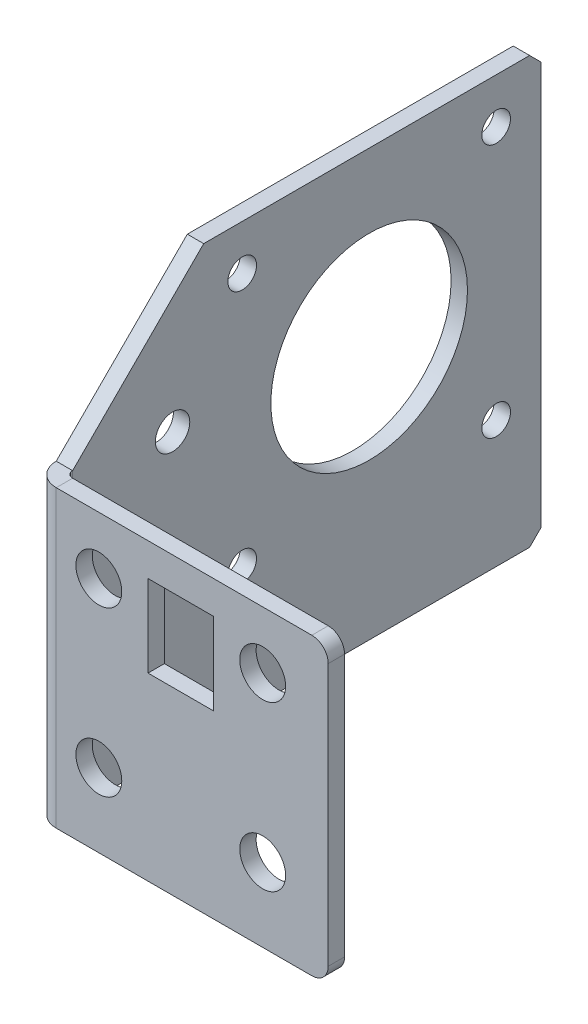
ISO-10303-21;
HEADER;
FILE_DESCRIPTION(('STEP AP214'),'2;1');
FILE_NAME('part.step','',(''),(''),'','','');
FILE_SCHEMA(('AUTOMOTIVE_DESIGN { 1 0 10303 214 1 1 1 1 }'));
ENDSEC;
DATA;
#1=APPLICATION_CONTEXT('core data for automotive mechanical design processes');
#2=APPLICATION_PROTOCOL_DEFINITION('international standard','automotive_design',2000,#1);
#3=PRODUCT_CONTEXT('',#1,'mechanical');
#4=PRODUCT('Part','Part','',(#3));
#5=PRODUCT_RELATED_PRODUCT_CATEGORY('part','',(#4));
#6=PRODUCT_DEFINITION_FORMATION('','',#4);
#7=PRODUCT_DEFINITION_CONTEXT('part definition',#1,'design');
#8=PRODUCT_DEFINITION('design','',#6,#7);
#9=PRODUCT_DEFINITION_SHAPE('','',#8);
#10=(LENGTH_UNIT() NAMED_UNIT(*) SI_UNIT(.MILLI.,.METRE.));
#11=(NAMED_UNIT(*) PLANE_ANGLE_UNIT() SI_UNIT($,.RADIAN.));
#12=(NAMED_UNIT(*) SI_UNIT($,.STERADIAN.) SOLID_ANGLE_UNIT());
#13=UNCERTAINTY_MEASURE_WITH_UNIT(LENGTH_MEASURE(1.E-05),#10,'distance_accuracy_value','');
#14=(GEOMETRIC_REPRESENTATION_CONTEXT(3) GLOBAL_UNCERTAINTY_ASSIGNED_CONTEXT((#13)) GLOBAL_UNIT_ASSIGNED_CONTEXT((#10,
#11,#12)) REPRESENTATION_CONTEXT('',''));
#15=CARTESIAN_POINT('',(0.,0.,0.));
#16=DIRECTION('',(0.,0.,1.));
#17=DIRECTION('',(1.,0.,0.));
#18=AXIS2_PLACEMENT_3D('',#15,#16,#17);
#19=CARTESIAN_POINT('',(0.,52.,0.));
#20=DIRECTION('',(0.,0.,-1.));
#21=DIRECTION('',(-1.,0.,0.));
#22=AXIS2_PLACEMENT_3D('',#19,#20,#21);
#23=PLANE('',#22);
#24=DIRECTION('',(-1.,0.,0.));
#25=VECTOR('',#24,1.);
#26=CARTESIAN_POINT('',(22.,22.,0.));
#27=LINE('',#26,#25);
#28=CARTESIAN_POINT('',(22.,22.,0.));
#29=VERTEX_POINT('',#28);
#30=CARTESIAN_POINT('',(14.,22.,0.));
#31=VERTEX_POINT('',#30);
#32=EDGE_CURVE('E163',#29,#31,#27,.T.);
#33=ORIENTED_EDGE('',*,*,#32,.T.);
#34=DIRECTION('',(0.,1.,0.));
#35=VECTOR('',#34,1.);
#36=CARTESIAN_POINT('',(14.,32.,0.));
#37=LINE('',#36,#35);
#38=CARTESIAN_POINT('',(14.,32.,0.));
#39=VERTEX_POINT('',#38);
#40=EDGE_CURVE('E157',#31,#39,#37,.T.);
#41=ORIENTED_EDGE('',*,*,#40,.T.);
#42=DIRECTION('',(1.,0.,0.));
#43=VECTOR('',#42,1.);
#44=CARTESIAN_POINT('',(22.,32.,0.));
#45=LINE('',#44,#43);
#46=CARTESIAN_POINT('',(22.,32.,0.));
#47=VERTEX_POINT('',#46);
#48=EDGE_CURVE('E166',#39,#47,#45,.T.);
#49=ORIENTED_EDGE('',*,*,#48,.T.);
#50=DIRECTION('',(0.,-1.,0.));
#51=VECTOR('',#50,1.);
#52=CARTESIAN_POINT('',(22.,32.,0.));
#53=LINE('',#52,#51);
#54=EDGE_CURVE('E52',#47,#29,#53,.T.);
#55=ORIENTED_EDGE('',*,*,#54,.T.);
#56=EDGE_LOOP('',(#33,#41,#49,#55));
#57=FACE_BOUND('',#56,.T.);
#58=CARTESIAN_POINT('',(8.,29.,0.));
#59=DIRECTION('',(0.,0.,1.));
#60=DIRECTION('',(-1.,0.,0.));
#61=AXIS2_PLACEMENT_3D('',#58,#59,#60);
#62=CIRCLE('',#61,2.8);
#63=CARTESIAN_POINT('',(5.2,29.,0.));
#64=VERTEX_POINT('',#63);
#65=EDGE_CURVE('E191',#64,#64,#62,.T.);
#66=ORIENTED_EDGE('',*,*,#65,.F.);
#67=EDGE_LOOP('',(#66));
#68=FACE_BOUND('',#67,.T.);
#69=CARTESIAN_POINT('',(8.,9.,0.));
#70=DIRECTION('',(0.,0.,1.));
#71=DIRECTION('',(1.,0.,0.));
#72=AXIS2_PLACEMENT_3D('',#69,#70,#71);
#73=CIRCLE('',#72,2.8);
#74=CARTESIAN_POINT('',(10.8,9.,0.));
#75=VERTEX_POINT('',#74);
#76=EDGE_CURVE('E205',#75,#75,#73,.T.);
#77=ORIENTED_EDGE('',*,*,#76,.F.);
#78=EDGE_LOOP('',(#77));
#79=FACE_BOUND('',#78,.T.);
#80=CARTESIAN_POINT('',(28.,9.,0.));
#81=DIRECTION('',(0.,0.,1.));
#82=DIRECTION('',(-1.,0.,0.));
#83=AXIS2_PLACEMENT_3D('',#80,#81,#82);
#84=CIRCLE('',#83,2.8);
#85=CARTESIAN_POINT('',(25.2,9.,0.));
#86=VERTEX_POINT('',#85);
#87=EDGE_CURVE('E199',#86,#86,#84,.T.);
#88=ORIENTED_EDGE('',*,*,#87,.F.);
#89=EDGE_LOOP('',(#88));
#90=FACE_BOUND('',#89,.T.);
#91=CARTESIAN_POINT('',(28.,29.,0.));
#92=DIRECTION('',(0.,0.,1.));
#93=DIRECTION('',(1.,0.,0.));
#94=AXIS2_PLACEMENT_3D('',#91,#92,#93);
#95=CIRCLE('',#94,2.8);
#96=CARTESIAN_POINT('',(30.8,29.,0.));
#97=VERTEX_POINT('',#96);
#98=EDGE_CURVE('E198',#97,#97,#95,.T.);
#99=ORIENTED_EDGE('',*,*,#98,.F.);
#100=EDGE_LOOP('',(#99));
#101=FACE_BOUND('',#100,.T.);
#102=DIRECTION('',(1.,0.,0.));
#103=VECTOR('',#102,1.);
#104=CARTESIAN_POINT('',(0.,0.,0.));
#105=LINE('',#104,#103);
#106=CARTESIAN_POINT('',(2.8,0.,0.));
#107=VERTEX_POINT('',#106);
#108=CARTESIAN_POINT('',(34.,0.,0.));
#109=VERTEX_POINT('',#108);
#110=EDGE_CURVE('E290',#107,#109,#105,.T.);
#111=ORIENTED_EDGE('',*,*,#110,.T.);
#112=CARTESIAN_POINT('',(34.,2.,0.));
#113=DIRECTION('',(0.,0.,-1.));
#114=DIRECTION('',(-1.,0.,0.));
#115=AXIS2_PLACEMENT_3D('',#112,#113,#114);
#116=CIRCLE('',#115,2.);
#117=CARTESIAN_POINT('',(36.,2.00000000000002,0.));
#118=VERTEX_POINT('',#117);
#119=EDGE_CURVE('E345',#109,#118,#116,.F.);
#120=ORIENTED_EDGE('',*,*,#119,.T.);
#121=DIRECTION('',(0.,-1.,0.));
#122=VECTOR('',#121,1.);
#123=CARTESIAN_POINT('',(36.,52.,0.));
#124=LINE('',#123,#122);
#125=CARTESIAN_POINT('',(36.,34.,0.));
#126=VERTEX_POINT('',#125);
#127=EDGE_CURVE('E331',#126,#118,#124,.T.);
#128=ORIENTED_EDGE('',*,*,#127,.F.);
#129=CARTESIAN_POINT('',(34.,34.,0.));
#130=DIRECTION('',(0.,0.,-1.));
#131=DIRECTION('',(-1.,0.,0.));
#132=AXIS2_PLACEMENT_3D('',#129,#130,#131);
#133=CIRCLE('',#132,2.);
#134=CARTESIAN_POINT('',(34.,36.,0.));
#135=VERTEX_POINT('',#134);
#136=EDGE_CURVE('E343',#126,#135,#133,.F.);
#137=ORIENTED_EDGE('',*,*,#136,.T.);
#138=DIRECTION('',(-1.,0.,0.));
#139=VECTOR('',#138,1.);
#140=CARTESIAN_POINT('',(0.,36.,0.));
#141=LINE('',#140,#139);
#142=CARTESIAN_POINT('',(2.8,36.,0.));
#143=VERTEX_POINT('',#142);
#144=EDGE_CURVE('E284',#135,#143,#141,.T.);
#145=ORIENTED_EDGE('',*,*,#144,.T.);
#146=DIRECTION('',(0.,-1.,0.));
#147=VECTOR('',#146,1.);
#148=CARTESIAN_POINT('',(2.8,52.,0.));
#149=LINE('',#148,#147);
#150=EDGE_CURVE('E298',#143,#107,#149,.T.);
#151=ORIENTED_EDGE('',*,*,#150,.T.);
#152=EDGE_LOOP('',(#111,#120,#128,#137,#145,#151));
#153=FACE_BOUND('',#152,.T.);
#154=ADVANCED_FACE('F37',(#57,#68,#79,#90,#101,#153),#23,.F.);
#155=CARTESIAN_POINT('',(36.,52.,-2.));
#156=DIRECTION('',(1.,0.,0.));
#157=DIRECTION('',(0.,0.,-1.));
#158=AXIS2_PLACEMENT_3D('',#155,#156,#157);
#159=PLANE('',#158);
#160=ORIENTED_EDGE('',*,*,#127,.T.);
#161=DIRECTION('',(0.,0.,1.));
#162=VECTOR('',#161,1.);
#163=CARTESIAN_POINT('',(36.,2.,-2.));
#164=LINE('',#163,#162);
#165=CARTESIAN_POINT('',(36.,2.00000000000002,-2.));
#166=VERTEX_POINT('',#165);
#167=EDGE_CURVE('E350',#118,#166,#164,.F.);
#168=ORIENTED_EDGE('',*,*,#167,.T.);
#169=DIRECTION('',(0.,-1.,0.));
#170=VECTOR('',#169,1.);
#171=CARTESIAN_POINT('',(36.,52.,-2.));
#172=LINE('',#171,#170);
#173=CARTESIAN_POINT('',(36.,34.,-2.));
#174=VERTEX_POINT('',#173);
#175=EDGE_CURVE('E328',#174,#166,#172,.T.);
#176=ORIENTED_EDGE('',*,*,#175,.F.);
#177=DIRECTION('',(0.,0.,-1.));
#178=VECTOR('',#177,1.);
#179=CARTESIAN_POINT('',(36.,34.,-2.));
#180=LINE('',#179,#178);
#181=EDGE_CURVE('E347',#174,#126,#180,.F.);
#182=ORIENTED_EDGE('',*,*,#181,.T.);
#183=EDGE_LOOP('',(#160,#168,#176,#182));
#184=FACE_BOUND('',#183,.T.);
#185=ADVANCED_FACE('F370',(#184),#159,.T.);
#186=CARTESIAN_POINT('',(0.,52.,-2.));
#187=DIRECTION('',(0.,0.,-1.));
#188=DIRECTION('',(-1.,0.,0.));
#189=AXIS2_PLACEMENT_3D('',#186,#187,#188);
#190=PLANE('',#189);
#191=DIRECTION('',(0.,1.,0.));
#192=VECTOR('',#191,1.);
#193=CARTESIAN_POINT('',(14.,32.,-2.));
#194=LINE('',#193,#192);
#195=CARTESIAN_POINT('',(14.,22.,-2.));
#196=VERTEX_POINT('',#195);
#197=CARTESIAN_POINT('',(14.,32.,-2.));
#198=VERTEX_POINT('',#197);
#199=EDGE_CURVE('E60',#196,#198,#194,.T.);
#200=ORIENTED_EDGE('',*,*,#199,.F.);
#201=DIRECTION('',(-1.,0.,0.));
#202=VECTOR('',#201,1.);
#203=CARTESIAN_POINT('',(22.,22.,-2.));
#204=LINE('',#203,#202);
#205=CARTESIAN_POINT('',(22.,22.,-2.));
#206=VERTEX_POINT('',#205);
#207=EDGE_CURVE('E172',#206,#196,#204,.T.);
#208=ORIENTED_EDGE('',*,*,#207,.F.);
#209=DIRECTION('',(0.,-1.,0.));
#210=VECTOR('',#209,1.);
#211=CARTESIAN_POINT('',(22.,32.,-2.));
#212=LINE('',#211,#210);
#213=CARTESIAN_POINT('',(22.,32.,-2.));
#214=VERTEX_POINT('',#213);
#215=EDGE_CURVE('E175',#214,#206,#212,.T.);
#216=ORIENTED_EDGE('',*,*,#215,.F.);
#217=DIRECTION('',(1.,0.,0.));
#218=VECTOR('',#217,1.);
#219=CARTESIAN_POINT('',(22.,32.,-2.));
#220=LINE('',#219,#218);
#221=EDGE_CURVE('E184',#198,#214,#220,.T.);
#222=ORIENTED_EDGE('',*,*,#221,.F.);
#223=EDGE_LOOP('',(#200,#208,#216,#222));
#224=FACE_BOUND('',#223,.T.);
#225=CARTESIAN_POINT('',(8.,29.,-2.));
#226=DIRECTION('',(0.,0.,1.));
#227=DIRECTION('',(-1.,0.,0.));
#228=AXIS2_PLACEMENT_3D('',#225,#226,#227);
#229=CIRCLE('',#228,2.8);
#230=CARTESIAN_POINT('',(5.2,29.,-2.));
#231=VERTEX_POINT('',#230);
#232=EDGE_CURVE('E208',#231,#231,#229,.T.);
#233=ORIENTED_EDGE('',*,*,#232,.T.);
#234=EDGE_LOOP('',(#233));
#235=FACE_BOUND('',#234,.T.);
#236=CARTESIAN_POINT('',(8.,9.,-2.));
#237=DIRECTION('',(0.,0.,1.));
#238=DIRECTION('',(1.,0.,0.));
#239=AXIS2_PLACEMENT_3D('',#236,#237,#238);
#240=CIRCLE('',#239,2.8);
#241=CARTESIAN_POINT('',(10.8,9.,-2.));
#242=VERTEX_POINT('',#241);
#243=EDGE_CURVE('E202',#242,#242,#240,.T.);
#244=ORIENTED_EDGE('',*,*,#243,.T.);
#245=EDGE_LOOP('',(#244));
#246=FACE_BOUND('',#245,.T.);
#247=CARTESIAN_POINT('',(28.,9.,-2.));
#248=DIRECTION('',(0.,0.,1.));
#249=DIRECTION('',(-1.,0.,0.));
#250=AXIS2_PLACEMENT_3D('',#247,#248,#249);
#251=CIRCLE('',#250,2.8);
#252=CARTESIAN_POINT('',(25.2,9.,-2.));
#253=VERTEX_POINT('',#252);
#254=EDGE_CURVE('E195',#253,#253,#251,.T.);
#255=ORIENTED_EDGE('',*,*,#254,.T.);
#256=EDGE_LOOP('',(#255));
#257=FACE_BOUND('',#256,.T.);
#258=CARTESIAN_POINT('',(28.,29.,-2.));
#259=DIRECTION('',(0.,0.,1.));
#260=DIRECTION('',(1.,0.,0.));
#261=AXIS2_PLACEMENT_3D('',#258,#259,#260);
#262=CIRCLE('',#261,2.8);
#263=CARTESIAN_POINT('',(30.8,29.,-2.));
#264=VERTEX_POINT('',#263);
#265=EDGE_CURVE('E213',#264,#264,#262,.T.);
#266=ORIENTED_EDGE('',*,*,#265,.T.);
#267=EDGE_LOOP('',(#266));
#268=FACE_BOUND('',#267,.T.);
#269=ORIENTED_EDGE('',*,*,#175,.T.);
#270=CARTESIAN_POINT('',(34.,2.,-2.));
#271=DIRECTION('',(0.,0.,-1.));
#272=DIRECTION('',(-1.,0.,0.));
#273=AXIS2_PLACEMENT_3D('',#270,#271,#272);
#274=CIRCLE('',#273,2.);
#275=CARTESIAN_POINT('',(34.,0.,-2.));
#276=VERTEX_POINT('',#275);
#277=EDGE_CURVE('E45',#166,#276,#274,.T.);
#278=ORIENTED_EDGE('',*,*,#277,.T.);
#279=DIRECTION('',(1.,0.,0.));
#280=VECTOR('',#279,1.);
#281=CARTESIAN_POINT('',(0.,0.,-2.));
#282=LINE('',#281,#280);
#283=CARTESIAN_POINT('',(2.8,0.,-2.));
#284=VERTEX_POINT('',#283);
#285=EDGE_CURVE('E301',#284,#276,#282,.T.);
#286=ORIENTED_EDGE('',*,*,#285,.F.);
#287=DIRECTION('',(0.,-1.,0.));
#288=VECTOR('',#287,1.);
#289=CARTESIAN_POINT('',(2.8,52.,-2.));
#290=LINE('',#289,#288);
#291=CARTESIAN_POINT('',(2.8,36.,-2.));
#292=VERTEX_POINT('',#291);
#293=EDGE_CURVE('E326',#292,#284,#290,.T.);
#294=ORIENTED_EDGE('',*,*,#293,.F.);
#295=DIRECTION('',(-1.,0.,0.));
#296=VECTOR('',#295,1.);
#297=CARTESIAN_POINT('',(0.,36.,-2.));
#298=LINE('',#297,#296);
#299=CARTESIAN_POINT('',(34.,36.,-2.));
#300=VERTEX_POINT('',#299);
#301=EDGE_CURVE('E264',#300,#292,#298,.T.);
#302=ORIENTED_EDGE('',*,*,#301,.F.);
#303=CARTESIAN_POINT('',(34.,34.,-2.));
#304=DIRECTION('',(0.,0.,-1.));
#305=DIRECTION('',(-1.,0.,0.));
#306=AXIS2_PLACEMENT_3D('',#303,#304,#305);
#307=CIRCLE('',#306,2.);
#308=EDGE_CURVE('E352',#300,#174,#307,.T.);
#309=ORIENTED_EDGE('',*,*,#308,.T.);
#310=EDGE_LOOP('',(#269,#278,#286,#294,#302,#309));
#311=FACE_BOUND('',#310,.T.);
#312=ADVANCED_FACE('F356',(#224,#235,#246,#257,#268,#311),#190,.T.);
#313=CARTESIAN_POINT('',(2.8,52.,-2.8));
#314=DIRECTION('',(0.,-1.,0.));
#315=DIRECTION('',(0.,0.,-1.));
#316=AXIS2_PLACEMENT_3D('',#313,#314,#315);
#317=CYLINDRICAL_SURFACE('',#316,0.8);
#318=DIRECTION('',(0.,-1.,0.));
#319=VECTOR('',#318,1.);
#320=CARTESIAN_POINT('',(2.,52.,-2.8));
#321=LINE('',#320,#319);
#322=CARTESIAN_POINT('',(2.,36.,-2.8));
#323=VERTEX_POINT('',#322);
#324=CARTESIAN_POINT('',(2.,0.,-2.8));
#325=VERTEX_POINT('',#324);
#326=EDGE_CURVE('E324',#323,#325,#321,.T.);
#327=ORIENTED_EDGE('',*,*,#326,.F.);
#328=CARTESIAN_POINT('',(2.8,36.,-2.8));
#329=DIRECTION('',(0.,-1.,0.));
#330=DIRECTION('',(0.,0.,-1.));
#331=AXIS2_PLACEMENT_3D('',#328,#329,#330);
#332=CIRCLE('',#331,0.8);
#333=EDGE_CURVE('E249',#292,#323,#332,.T.);
#334=ORIENTED_EDGE('',*,*,#333,.F.);
#335=ORIENTED_EDGE('',*,*,#293,.T.);
#336=CARTESIAN_POINT('',(2.8,0.,-2.8));
#337=DIRECTION('',(0.,1.,0.));
#338=DIRECTION('',(1.,0.,0.));
#339=AXIS2_PLACEMENT_3D('',#336,#337,#338);
#340=CIRCLE('',#339,0.8);
#341=EDGE_CURVE('E304',#325,#284,#340,.T.);
#342=ORIENTED_EDGE('',*,*,#341,.F.);
#343=EDGE_LOOP('',(#327,#334,#335,#342));
#344=FACE_BOUND('',#343,.T.);
#345=ADVANCED_FACE('F394',(#344),#317,.F.);
#346=CARTESIAN_POINT('',(2.,52.,0.));
#347=DIRECTION('',(1.,0.,0.));
#348=DIRECTION('',(0.,0.,-1.));
#349=AXIS2_PLACEMENT_3D('',#346,#347,#348);
#350=PLANE('',#349);
#351=CARTESIAN_POINT('',(2.,34.,-15.));
#352=DIRECTION('',(1.,0.,0.));
#353=DIRECTION('',(0.,0.,-1.));
#354=AXIS2_PLACEMENT_3D('',#351,#352,#353);
#355=CIRCLE('',#354,2.1);
#356=CARTESIAN_POINT('',(2.,34.,-17.1));
#357=VERTEX_POINT('',#356);
#358=EDGE_CURVE('E178',#357,#357,#355,.T.);
#359=ORIENTED_EDGE('',*,*,#358,.F.);
#360=EDGE_LOOP('',(#359));
#361=FACE_BOUND('',#360,.T.);
#362=CARTESIAN_POINT('',(2.,15.5,-23.5));
#363=DIRECTION('',(1.,0.,0.));
#364=DIRECTION('',(0.,0.,-1.));
#365=AXIS2_PLACEMENT_3D('',#362,#363,#364);
#366=CIRCLE('',#365,1.75);
#367=CARTESIAN_POINT('',(2.,15.5,-25.25));
#368=VERTEX_POINT('',#367);
#369=EDGE_CURVE('E216',#368,#368,#366,.T.);
#370=ORIENTED_EDGE('',*,*,#369,.F.);
#371=EDGE_LOOP('',(#370));
#372=FACE_BOUND('',#371,.T.);
#373=CARTESIAN_POINT('',(2.,15.5,-54.5));
#374=DIRECTION('',(1.,0.,0.));
#375=DIRECTION('',(0.,0.,1.));
#376=AXIS2_PLACEMENT_3D('',#373,#374,#375);
#377=CIRCLE('',#376,1.75);
#378=CARTESIAN_POINT('',(2.,15.5,-52.75));
#379=VERTEX_POINT('',#378);
#380=EDGE_CURVE('E235',#379,#379,#377,.T.);
#381=ORIENTED_EDGE('',*,*,#380,.F.);
#382=EDGE_LOOP('',(#381));
#383=FACE_BOUND('',#382,.T.);
#384=CARTESIAN_POINT('',(2.,46.5,-54.5));
#385=DIRECTION('',(1.,0.,0.));
#386=DIRECTION('',(0.,0.,-1.));
#387=AXIS2_PLACEMENT_3D('',#384,#385,#386);
#388=CIRCLE('',#387,1.75);
#389=CARTESIAN_POINT('',(2.,46.5,-56.25));
#390=VERTEX_POINT('',#389);
#391=EDGE_CURVE('E229',#390,#390,#388,.T.);
#392=ORIENTED_EDGE('',*,*,#391,.F.);
#393=EDGE_LOOP('',(#392));
#394=FACE_BOUND('',#393,.T.);
#395=CARTESIAN_POINT('',(2.,46.5,-23.5));
#396=DIRECTION('',(1.,0.,0.));
#397=DIRECTION('',(0.,0.,1.));
#398=AXIS2_PLACEMENT_3D('',#395,#396,#397);
#399=CIRCLE('',#398,1.75);
#400=CARTESIAN_POINT('',(2.,46.5,-21.75));
#401=VERTEX_POINT('',#400);
#402=EDGE_CURVE('E223',#401,#401,#399,.T.);
#403=ORIENTED_EDGE('',*,*,#402,.F.);
#404=EDGE_LOOP('',(#403));
#405=FACE_BOUND('',#404,.T.);
#406=CARTESIAN_POINT('',(2.,31.,-39.));
#407=DIRECTION('',(1.,0.,0.));
#408=DIRECTION('',(0.,0.,-1.));
#409=AXIS2_PLACEMENT_3D('',#406,#407,#408);
#410=CIRCLE('',#409,12.);
#411=CARTESIAN_POINT('',(2.,31.,-51.));
#412=VERTEX_POINT('',#411);
#413=EDGE_CURVE('E222',#412,#412,#410,.T.);
#414=ORIENTED_EDGE('',*,*,#413,.F.);
#415=EDGE_LOOP('',(#414));
#416=FACE_BOUND('',#415,.T.);
#417=DIRECTION('',(0.,-1.,0.));
#418=VECTOR('',#417,1.);
#419=CARTESIAN_POINT('',(2.,52.,-60.));
#420=LINE('',#419,#418);
#421=CARTESIAN_POINT('',(2.,50.5857864376269,-60.));
#422=VERTEX_POINT('',#421);
#423=CARTESIAN_POINT('',(2.,1.41421356237312,-60.));
#424=VERTEX_POINT('',#423);
#425=EDGE_CURVE('E321',#422,#424,#420,.T.);
#426=ORIENTED_EDGE('',*,*,#425,.F.);
#427=DIRECTION('',(0.,-0.707106781186555,-0.707106781186541));
#428=VECTOR('',#427,1.);
#429=CARTESIAN_POINT('',(2.,81.2928932188134,-29.292893218814));
#430=LINE('',#429,#428);
#431=CARTESIAN_POINT('',(2.,52.,-58.5857864376269));
#432=VERTEX_POINT('',#431);
#433=EDGE_CURVE('E246',#432,#422,#430,.T.);
#434=ORIENTED_EDGE('',*,*,#433,.F.);
#435=DIRECTION('',(0.,0.,-1.));
#436=VECTOR('',#435,1.);
#437=CARTESIAN_POINT('',(2.,52.,0.));
#438=LINE('',#437,#436);
#439=CARTESIAN_POINT('',(2.,52.,-18.7999999999999));
#440=VERTEX_POINT('',#439);
#441=EDGE_CURVE('E291',#432,#440,#438,.F.);
#442=ORIENTED_EDGE('',*,*,#441,.T.);
#443=DIRECTION('',(0.,0.707106781186549,-0.707106781186546));
#444=VECTOR('',#443,1.);
#445=CARTESIAN_POINT('',(2.,42.6,-9.40000000000001));
#446=LINE('',#445,#444);
#447=EDGE_CURVE('E252',#323,#440,#446,.T.);
#448=ORIENTED_EDGE('',*,*,#447,.F.);
#449=ORIENTED_EDGE('',*,*,#326,.T.);
#450=DIRECTION('',(0.,0.,-1.));
#451=VECTOR('',#450,1.);
#452=CARTESIAN_POINT('',(2.,0.,0.));
#453=LINE('',#452,#451);
#454=CARTESIAN_POINT('',(2.,0.,-58.5857864376269));
#455=VERTEX_POINT('',#454);
#456=EDGE_CURVE('E307',#455,#325,#453,.F.);
#457=ORIENTED_EDGE('',*,*,#456,.F.);
#458=DIRECTION('',(0.,-0.707106781186555,0.707106781186541));
#459=VECTOR('',#458,1.);
#460=CARTESIAN_POINT('',(2.,-3.29289321881294,-55.292893218814));
#461=LINE('',#460,#459);
#462=EDGE_CURVE('E270',#424,#455,#461,.T.);
#463=ORIENTED_EDGE('',*,*,#462,.F.);
#464=EDGE_LOOP('',(#426,#434,#442,#448,#449,#457,#463));
#465=FACE_BOUND('',#464,.T.);
#466=ADVANCED_FACE('F400',(#361,#372,#383,#394,#405,#416,#465),#350,.T.);
#467=CARTESIAN_POINT('',(0.,52.,-60.));
#468=DIRECTION('',(0.,0.,-1.));
#469=DIRECTION('',(-1.,0.,0.));
#470=AXIS2_PLACEMENT_3D('',#467,#468,#469);
#471=PLANE('',#470);
#472=DIRECTION('',(0.,-1.,0.));
#473=VECTOR('',#472,1.);
#474=CARTESIAN_POINT('',(0.,52.,-60.));
#475=LINE('',#474,#473);
#476=CARTESIAN_POINT('',(0.,50.5857864376269,-60.));
#477=VERTEX_POINT('',#476);
#478=CARTESIAN_POINT('',(0.,1.41421356237314,-60.));
#479=VERTEX_POINT('',#478);
#480=EDGE_CURVE('E318',#477,#479,#475,.T.);
#481=ORIENTED_EDGE('',*,*,#480,.F.);
#482=DIRECTION('',(1.,0.,0.));
#483=VECTOR('',#482,1.);
#484=CARTESIAN_POINT('',(2.,50.5857864376269,-60.));
#485=LINE('',#484,#483);
#486=EDGE_CURVE('E272',#422,#477,#485,.F.);
#487=ORIENTED_EDGE('',*,*,#486,.F.);
#488=ORIENTED_EDGE('',*,*,#425,.T.);
#489=DIRECTION('',(1.,0.,0.));
#490=VECTOR('',#489,1.);
#491=CARTESIAN_POINT('',(2.,1.41421356237312,-60.));
#492=LINE('',#491,#490);
#493=EDGE_CURVE('E269',#424,#479,#492,.F.);
#494=ORIENTED_EDGE('',*,*,#493,.T.);
#495=EDGE_LOOP('',(#481,#487,#488,#494));
#496=FACE_BOUND('',#495,.T.);
#497=ADVANCED_FACE('F421',(#496),#471,.T.);
#498=CARTESIAN_POINT('',(0.,52.,0.));
#499=DIRECTION('',(1.,0.,0.));
#500=DIRECTION('',(0.,0.,-1.));
#501=AXIS2_PLACEMENT_3D('',#498,#499,#500);
#502=PLANE('',#501);
#503=CARTESIAN_POINT('',(0.,34.,-15.));
#504=DIRECTION('',(1.,0.,0.));
#505=DIRECTION('',(0.,0.,-1.));
#506=AXIS2_PLACEMENT_3D('',#503,#504,#505);
#507=CIRCLE('',#506,2.1);
#508=CARTESIAN_POINT('',(0.,34.,-17.1));
#509=VERTEX_POINT('',#508);
#510=EDGE_CURVE('E185',#509,#509,#507,.T.);
#511=ORIENTED_EDGE('',*,*,#510,.T.);
#512=EDGE_LOOP('',(#511));
#513=FACE_BOUND('',#512,.T.);
#514=CARTESIAN_POINT('',(0.,15.5,-23.5));
#515=DIRECTION('',(1.,0.,0.));
#516=DIRECTION('',(0.,0.,-1.));
#517=AXIS2_PLACEMENT_3D('',#514,#515,#516);
#518=CIRCLE('',#517,1.75);
#519=CARTESIAN_POINT('',(0.,15.5,-25.25));
#520=VERTEX_POINT('',#519);
#521=EDGE_CURVE('E238',#520,#520,#518,.T.);
#522=ORIENTED_EDGE('',*,*,#521,.T.);
#523=EDGE_LOOP('',(#522));
#524=FACE_BOUND('',#523,.T.);
#525=CARTESIAN_POINT('',(0.,15.5,-54.5));
#526=DIRECTION('',(1.,0.,0.));
#527=DIRECTION('',(0.,0.,1.));
#528=AXIS2_PLACEMENT_3D('',#525,#526,#527);
#529=CIRCLE('',#528,1.75);
#530=CARTESIAN_POINT('',(0.,15.5,-52.75));
#531=VERTEX_POINT('',#530);
#532=EDGE_CURVE('E232',#531,#531,#529,.T.);
#533=ORIENTED_EDGE('',*,*,#532,.T.);
#534=EDGE_LOOP('',(#533));
#535=FACE_BOUND('',#534,.T.);
#536=CARTESIAN_POINT('',(0.,46.5,-54.5));
#537=DIRECTION('',(1.,0.,0.));
#538=DIRECTION('',(0.,0.,-1.));
#539=AXIS2_PLACEMENT_3D('',#536,#537,#538);
#540=CIRCLE('',#539,1.75);
#541=CARTESIAN_POINT('',(0.,46.5,-56.25));
#542=VERTEX_POINT('',#541);
#543=EDGE_CURVE('E226',#542,#542,#540,.T.);
#544=ORIENTED_EDGE('',*,*,#543,.T.);
#545=EDGE_LOOP('',(#544));
#546=FACE_BOUND('',#545,.T.);
#547=CARTESIAN_POINT('',(0.,46.5,-23.5));
#548=DIRECTION('',(1.,0.,0.));
#549=DIRECTION('',(0.,0.,1.));
#550=AXIS2_PLACEMENT_3D('',#547,#548,#549);
#551=CIRCLE('',#550,1.75);
#552=CARTESIAN_POINT('',(0.,46.5,-21.75));
#553=VERTEX_POINT('',#552);
#554=EDGE_CURVE('E219',#553,#553,#551,.T.);
#555=ORIENTED_EDGE('',*,*,#554,.T.);
#556=EDGE_LOOP('',(#555));
#557=FACE_BOUND('',#556,.T.);
#558=CARTESIAN_POINT('',(0.,31.,-39.));
#559=DIRECTION('',(1.,0.,0.));
#560=DIRECTION('',(0.,0.,-1.));
#561=AXIS2_PLACEMENT_3D('',#558,#559,#560);
#562=CIRCLE('',#561,12.);
#563=CARTESIAN_POINT('',(0.,31.,-51.));
#564=VERTEX_POINT('',#563);
#565=EDGE_CURVE('E243',#564,#564,#562,.T.);
#566=ORIENTED_EDGE('',*,*,#565,.T.);
#567=EDGE_LOOP('',(#566));
#568=FACE_BOUND('',#567,.T.);
#569=DIRECTION('',(0.,-0.707106781186555,-0.707106781186541));
#570=VECTOR('',#569,1.);
#571=CARTESIAN_POINT('',(0.,81.2928932188134,-29.292893218814));
#572=LINE('',#571,#570);
#573=CARTESIAN_POINT('',(0.,52.,-58.5857864376269));
#574=VERTEX_POINT('',#573);
#575=EDGE_CURVE('E276',#574,#477,#572,.T.);
#576=ORIENTED_EDGE('',*,*,#575,.T.);
#577=ORIENTED_EDGE('',*,*,#480,.T.);
#578=DIRECTION('',(0.,-0.707106781186555,0.707106781186541));
#579=VECTOR('',#578,1.);
#580=CARTESIAN_POINT('',(0.,-3.29289321881294,-55.292893218814));
#581=LINE('',#580,#579);
#582=CARTESIAN_POINT('',(0.,0.,-58.5857864376269));
#583=VERTEX_POINT('',#582);
#584=EDGE_CURVE('E266',#479,#583,#581,.T.);
#585=ORIENTED_EDGE('',*,*,#584,.T.);
#586=DIRECTION('',(0.,0.,1.));
#587=VECTOR('',#586,1.);
#588=CARTESIAN_POINT('',(0.,0.,0.));
#589=LINE('',#588,#587);
#590=CARTESIAN_POINT('',(0.,0.,-2.8));
#591=VERTEX_POINT('',#590);
#592=EDGE_CURVE('E310',#583,#591,#589,.T.);
#593=ORIENTED_EDGE('',*,*,#592,.T.);
#594=DIRECTION('',(0.,-1.,0.));
#595=VECTOR('',#594,1.);
#596=CARTESIAN_POINT('',(0.,52.,-2.8));
#597=LINE('',#596,#595);
#598=CARTESIAN_POINT('',(0.,36.,-2.8));
#599=VERTEX_POINT('',#598);
#600=EDGE_CURVE('E316',#599,#591,#597,.T.);
#601=ORIENTED_EDGE('',*,*,#600,.F.);
#602=DIRECTION('',(0.,0.707106781186549,-0.707106781186546));
#603=VECTOR('',#602,1.);
#604=CARTESIAN_POINT('',(0.,42.6,-9.40000000000001));
#605=LINE('',#604,#603);
#606=CARTESIAN_POINT('',(0.,52.,-18.7999999999999));
#607=VERTEX_POINT('',#606);
#608=EDGE_CURVE('E257',#599,#607,#605,.T.);
#609=ORIENTED_EDGE('',*,*,#608,.T.);
#610=DIRECTION('',(0.,0.,1.));
#611=VECTOR('',#610,1.);
#612=CARTESIAN_POINT('',(0.,52.,0.));
#613=LINE('',#612,#611);
#614=EDGE_CURVE('E294',#574,#607,#613,.T.);
#615=ORIENTED_EDGE('',*,*,#614,.F.);
#616=EDGE_LOOP('',(#576,#577,#585,#593,#601,#609,#615));
#617=FACE_BOUND('',#616,.T.);
#618=ADVANCED_FACE('F411',(#513,#524,#535,#546,#557,#568,#617),#502,.F.);
#619=CARTESIAN_POINT('',(2.8,52.,-2.8));
#620=DIRECTION('',(0.,-1.,0.));
#621=DIRECTION('',(0.,0.,-1.));
#622=AXIS2_PLACEMENT_3D('',#619,#620,#621);
#623=CYLINDRICAL_SURFACE('',#622,2.8);
#624=CARTESIAN_POINT('',(2.8,36.,-2.8));
#625=DIRECTION('',(0.,-1.,0.));
#626=DIRECTION('',(0.,0.,-1.));
#627=AXIS2_PLACEMENT_3D('',#624,#625,#626);
#628=CIRCLE('',#627,2.8);
#629=EDGE_CURVE('E253',#143,#599,#628,.T.);
#630=ORIENTED_EDGE('',*,*,#629,.T.);
#631=ORIENTED_EDGE('',*,*,#600,.T.);
#632=CARTESIAN_POINT('',(2.8,0.,-2.8));
#633=DIRECTION('',(0.,-1.,0.));
#634=DIRECTION('',(0.,0.,-1.));
#635=AXIS2_PLACEMENT_3D('',#632,#633,#634);
#636=CIRCLE('',#635,2.8);
#637=EDGE_CURVE('E295',#591,#107,#636,.F.);
#638=ORIENTED_EDGE('',*,*,#637,.T.);
#639=ORIENTED_EDGE('',*,*,#150,.F.);
#640=EDGE_LOOP('',(#630,#631,#638,#639));
#641=FACE_BOUND('',#640,.T.);
#642=ADVANCED_FACE('F385',(#641),#623,.T.);
#643=CARTESIAN_POINT('',(2.8,0.,-2.8));
#644=DIRECTION('',(0.,1.,0.));
#645=DIRECTION('',(1.,0.,0.));
#646=AXIS2_PLACEMENT_3D('',#643,#644,#645);
#647=PLANE('',#646);
#648=DIRECTION('',(1.,0.,0.));
#649=VECTOR('',#648,1.);
#650=CARTESIAN_POINT('',(2.,0.,-58.5857864376269));
#651=LINE('',#650,#649);
#652=EDGE_CURVE('E256',#455,#583,#651,.F.);
#653=ORIENTED_EDGE('',*,*,#652,.F.);
#654=ORIENTED_EDGE('',*,*,#456,.T.);
#655=DIRECTION('',(-1.,0.,0.));
#656=VECTOR('',#655,1.);
#657=CARTESIAN_POINT('',(2.,0.,-2.8));
#658=LINE('',#657,#656);
#659=EDGE_CURVE('E334',#325,#591,#658,.T.);
#660=ORIENTED_EDGE('',*,*,#659,.T.);
#661=ORIENTED_EDGE('',*,*,#592,.F.);
#662=EDGE_LOOP('',(#653,#654,#660,#661));
#663=FACE_BOUND('',#662,.T.);
#664=ADVANCED_FACE('F416',(#663),#647,.F.);
#665=CARTESIAN_POINT('',(2.8,52.,-2.));
#666=DIRECTION('',(0.,1.,0.));
#667=DIRECTION('',(0.,0.,1.));
#668=AXIS2_PLACEMENT_3D('',#665,#666,#667);
#669=PLANE('',#668);
#670=ORIENTED_EDGE('',*,*,#441,.F.);
#671=DIRECTION('',(1.,0.,0.));
#672=VECTOR('',#671,1.);
#673=CARTESIAN_POINT('',(2.,52.,-58.5857864376269));
#674=LINE('',#673,#672);
#675=EDGE_CURVE('E279',#432,#574,#674,.F.);
#676=ORIENTED_EDGE('',*,*,#675,.T.);
#677=ORIENTED_EDGE('',*,*,#614,.T.);
#678=DIRECTION('',(1.,0.,0.));
#679=VECTOR('',#678,1.);
#680=CARTESIAN_POINT('',(2.,52.,-18.7999999999999));
#681=LINE('',#680,#679);
#682=EDGE_CURVE('E262',#440,#607,#681,.F.);
#683=ORIENTED_EDGE('',*,*,#682,.F.);
#684=EDGE_LOOP('',(#670,#676,#677,#683));
#685=FACE_BOUND('',#684,.T.);
#686=ADVANCED_FACE('F408',(#685),#669,.T.);
#687=CARTESIAN_POINT('',(2.8,0.,0.));
#688=DIRECTION('',(0.,-1.,0.));
#689=DIRECTION('',(0.,0.,-1.));
#690=AXIS2_PLACEMENT_3D('',#687,#688,#689);
#691=PLANE('',#690);
#692=DIRECTION('',(0.,0.,-1.));
#693=VECTOR('',#692,1.);
#694=CARTESIAN_POINT('',(2.8,0.,0.));
#695=LINE('',#694,#693);
#696=EDGE_CURVE('E337',#107,#284,#695,.T.);
#697=ORIENTED_EDGE('',*,*,#696,.F.);
#698=ORIENTED_EDGE('',*,*,#637,.F.);
#699=ORIENTED_EDGE('',*,*,#659,.F.);
#700=ORIENTED_EDGE('',*,*,#341,.T.);
#701=EDGE_LOOP('',(#697,#698,#699,#700));
#702=FACE_BOUND('',#701,.T.);
#703=ADVANCED_FACE('F389',(#702),#691,.T.);
#704=CARTESIAN_POINT('',(2.,0.,-2.8));
#705=DIRECTION('',(0.,-1.,0.));
#706=DIRECTION('',(0.,0.,-1.));
#707=AXIS2_PLACEMENT_3D('',#704,#705,#706);
#708=PLANE('',#707);
#709=ORIENTED_EDGE('',*,*,#285,.T.);
#710=DIRECTION('',(0.,0.,1.));
#711=VECTOR('',#710,1.);
#712=CARTESIAN_POINT('',(34.,0.,-2.8));
#713=LINE('',#712,#711);
#714=EDGE_CURVE('E340',#276,#109,#713,.T.);
#715=ORIENTED_EDGE('',*,*,#714,.T.);
#716=ORIENTED_EDGE('',*,*,#110,.F.);
#717=ORIENTED_EDGE('',*,*,#696,.T.);
#718=EDGE_LOOP('',(#709,#715,#716,#717));
#719=FACE_BOUND('',#718,.T.);
#720=ADVANCED_FACE('F363',(#719),#708,.T.);
#721=CARTESIAN_POINT('',(2.,-3.29289321881294,-55.292893218814));
#722=DIRECTION('',(0.,0.707106781186541,0.707106781186554));
#723=DIRECTION('',(0.,-0.707106781186555,0.707106781186541));
#724=AXIS2_PLACEMENT_3D('',#721,#722,#723);
#725=PLANE('',#724);
#726=ORIENTED_EDGE('',*,*,#462,.T.);
#727=ORIENTED_EDGE('',*,*,#652,.T.);
#728=ORIENTED_EDGE('',*,*,#584,.F.);
#729=ORIENTED_EDGE('',*,*,#493,.F.);
#730=EDGE_LOOP('',(#726,#727,#728,#729));
#731=FACE_BOUND('',#730,.T.);
#732=ADVANCED_FACE('F443',(#731),#725,.F.);
#733=CARTESIAN_POINT('',(0.,36.,-2.));
#734=DIRECTION('',(0.,-1.,0.));
#735=DIRECTION('',(-1.,0.,0.));
#736=AXIS2_PLACEMENT_3D('',#733,#734,#735);
#737=PLANE('',#736);
#738=ORIENTED_EDGE('',*,*,#144,.F.);
#739=DIRECTION('',(0.,0.,1.));
#740=VECTOR('',#739,1.);
#741=CARTESIAN_POINT('',(34.,36.,-2.));
#742=LINE('',#741,#740);
#743=EDGE_CURVE('E11',#135,#300,#742,.F.);
#744=ORIENTED_EDGE('',*,*,#743,.T.);
#745=ORIENTED_EDGE('',*,*,#301,.T.);
#746=DIRECTION('',(0.,0.,-1.));
#747=VECTOR('',#746,1.);
#748=CARTESIAN_POINT('',(2.8,36.,-2.));
#749=LINE('',#748,#747);
#750=EDGE_CURVE('E286',#292,#143,#749,.F.);
#751=ORIENTED_EDGE('',*,*,#750,.T.);
#752=EDGE_LOOP('',(#738,#744,#745,#751));
#753=FACE_BOUND('',#752,.T.);
#754=ADVANCED_FACE('F378',(#753),#737,.F.);
#755=CARTESIAN_POINT('',(2.,42.6,-9.40000000000001));
#756=DIRECTION('',(0.,-0.707106781186546,-0.707106781186549));
#757=DIRECTION('',(0.,0.707106781186549,-0.707106781186546));
#758=AXIS2_PLACEMENT_3D('',#755,#756,#757);
#759=PLANE('',#758);
#760=ORIENTED_EDGE('',*,*,#447,.T.);
#761=ORIENTED_EDGE('',*,*,#682,.T.);
#762=ORIENTED_EDGE('',*,*,#608,.F.);
#763=DIRECTION('',(1.,0.,0.));
#764=VECTOR('',#763,1.);
#765=CARTESIAN_POINT('',(2.,36.,-2.8));
#766=LINE('',#765,#764);
#767=EDGE_CURVE('E260',#323,#599,#766,.F.);
#768=ORIENTED_EDGE('',*,*,#767,.F.);
#769=EDGE_LOOP('',(#760,#761,#762,#768));
#770=FACE_BOUND('',#769,.T.);
#771=ADVANCED_FACE('F406',(#770),#759,.F.);
#772=CARTESIAN_POINT('',(2.8,36.,-2.8));
#773=DIRECTION('',(0.,1.,0.));
#774=DIRECTION('',(0.,0.,1.));
#775=AXIS2_PLACEMENT_3D('',#772,#773,#774);
#776=PLANE('',#775);
#777=ORIENTED_EDGE('',*,*,#767,.T.);
#778=ORIENTED_EDGE('',*,*,#629,.F.);
#779=ORIENTED_EDGE('',*,*,#750,.F.);
#780=ORIENTED_EDGE('',*,*,#333,.T.);
#781=EDGE_LOOP('',(#777,#778,#779,#780));
#782=FACE_BOUND('',#781,.T.);
#783=ADVANCED_FACE('F396',(#782),#776,.T.);
#784=CARTESIAN_POINT('',(2.,81.2928932188134,-29.292893218814));
#785=DIRECTION('',(0.,-0.707106781186541,0.707106781186554));
#786=DIRECTION('',(0.,-0.707106781186555,-0.707106781186541));
#787=AXIS2_PLACEMENT_3D('',#784,#785,#786);
#788=PLANE('',#787);
#789=ORIENTED_EDGE('',*,*,#433,.T.);
#790=ORIENTED_EDGE('',*,*,#486,.T.);
#791=ORIENTED_EDGE('',*,*,#575,.F.);
#792=ORIENTED_EDGE('',*,*,#675,.F.);
#793=EDGE_LOOP('',(#789,#790,#791,#792));
#794=FACE_BOUND('',#793,.T.);
#795=ADVANCED_FACE('F423',(#794),#788,.F.);
#796=CARTESIAN_POINT('',(34.,2.,-2.8));
#797=DIRECTION('',(0.,0.,1.));
#798=DIRECTION('',(1.,0.,0.));
#799=AXIS2_PLACEMENT_3D('',#796,#797,#798);
#800=CYLINDRICAL_SURFACE('',#799,2.);
#801=ORIENTED_EDGE('',*,*,#277,.F.);
#802=ORIENTED_EDGE('',*,*,#167,.F.);
#803=ORIENTED_EDGE('',*,*,#119,.F.);
#804=ORIENTED_EDGE('',*,*,#714,.F.);
#805=EDGE_LOOP('',(#801,#802,#803,#804));
#806=FACE_BOUND('',#805,.T.);
#807=ADVANCED_FACE('F366',(#806),#800,.T.);
#808=CARTESIAN_POINT('',(34.,34.,-2.));
#809=DIRECTION('',(0.,0.,-1.));
#810=DIRECTION('',(-1.,0.,0.));
#811=AXIS2_PLACEMENT_3D('',#808,#809,#810);
#812=CYLINDRICAL_SURFACE('',#811,2.);
#813=ORIENTED_EDGE('',*,*,#308,.F.);
#814=ORIENTED_EDGE('',*,*,#743,.F.);
#815=ORIENTED_EDGE('',*,*,#136,.F.);
#816=ORIENTED_EDGE('',*,*,#181,.F.);
#817=EDGE_LOOP('',(#813,#814,#815,#816));
#818=FACE_BOUND('',#817,.T.);
#819=ADVANCED_FACE('F39',(#818),#812,.T.);
#820=CARTESIAN_POINT('',(0.,31.,-39.));
#821=DIRECTION('',(1.,0.,0.));
#822=DIRECTION('',(0.,0.,-1.));
#823=AXIS2_PLACEMENT_3D('',#820,#821,#822);
#824=CYLINDRICAL_SURFACE('',#823,12.);
#825=ORIENTED_EDGE('',*,*,#565,.F.);
#826=EDGE_LOOP('',(#825));
#827=FACE_BOUND('',#826,.T.);
#828=ORIENTED_EDGE('',*,*,#413,.T.);
#829=EDGE_LOOP('',(#828));
#830=FACE_BOUND('',#829,.T.);
#831=ADVANCED_FACE('F505',(#827,#830),#824,.F.);
#832=CARTESIAN_POINT('',(0.,46.5,-23.5));
#833=DIRECTION('',(1.,0.,0.));
#834=DIRECTION('',(0.,0.,-1.));
#835=AXIS2_PLACEMENT_3D('',#832,#833,#834);
#836=CYLINDRICAL_SURFACE('',#835,1.75);
#837=ORIENTED_EDGE('',*,*,#554,.F.);
#838=EDGE_LOOP('',(#837));
#839=FACE_BOUND('',#838,.T.);
#840=ORIENTED_EDGE('',*,*,#402,.T.);
#841=EDGE_LOOP('',(#840));
#842=FACE_BOUND('',#841,.T.);
#843=ADVANCED_FACE('F501',(#839,#842),#836,.F.);
#844=CARTESIAN_POINT('',(0.,46.5,-54.5));
#845=DIRECTION('',(1.,0.,0.));
#846=DIRECTION('',(0.,0.,-1.));
#847=AXIS2_PLACEMENT_3D('',#844,#845,#846);
#848=CYLINDRICAL_SURFACE('',#847,1.75);
#849=ORIENTED_EDGE('',*,*,#543,.F.);
#850=EDGE_LOOP('',(#849));
#851=FACE_BOUND('',#850,.T.);
#852=ORIENTED_EDGE('',*,*,#391,.T.);
#853=EDGE_LOOP('',(#852));
#854=FACE_BOUND('',#853,.T.);
#855=ADVANCED_FACE('F504',(#851,#854),#848,.F.);
#856=CARTESIAN_POINT('',(0.,15.5,-54.5));
#857=DIRECTION('',(1.,0.,0.));
#858=DIRECTION('',(0.,0.,-1.));
#859=AXIS2_PLACEMENT_3D('',#856,#857,#858);
#860=CYLINDRICAL_SURFACE('',#859,1.75);
#861=ORIENTED_EDGE('',*,*,#532,.F.);
#862=EDGE_LOOP('',(#861));
#863=FACE_BOUND('',#862,.T.);
#864=ORIENTED_EDGE('',*,*,#380,.T.);
#865=EDGE_LOOP('',(#864));
#866=FACE_BOUND('',#865,.T.);
#867=ADVANCED_FACE('F494',(#863,#866),#860,.F.);
#868=CARTESIAN_POINT('',(0.,15.5,-23.5));
#869=DIRECTION('',(1.,0.,0.));
#870=DIRECTION('',(0.,0.,-1.));
#871=AXIS2_PLACEMENT_3D('',#868,#869,#870);
#872=CYLINDRICAL_SURFACE('',#871,1.75);
#873=ORIENTED_EDGE('',*,*,#521,.F.);
#874=EDGE_LOOP('',(#873));
#875=FACE_BOUND('',#874,.T.);
#876=ORIENTED_EDGE('',*,*,#369,.T.);
#877=EDGE_LOOP('',(#876));
#878=FACE_BOUND('',#877,.T.);
#879=ADVANCED_FACE('F483',(#875,#878),#872,.F.);
#880=CARTESIAN_POINT('',(28.,29.,-2.));
#881=DIRECTION('',(0.,0.,1.));
#882=DIRECTION('',(1.,0.,0.));
#883=AXIS2_PLACEMENT_3D('',#880,#881,#882);
#884=CYLINDRICAL_SURFACE('',#883,2.8);
#885=ORIENTED_EDGE('',*,*,#265,.F.);
#886=EDGE_LOOP('',(#885));
#887=FACE_BOUND('',#886,.T.);
#888=ORIENTED_EDGE('',*,*,#98,.T.);
#889=EDGE_LOOP('',(#888));
#890=FACE_BOUND('',#889,.T.);
#891=ADVANCED_FACE('F479',(#887,#890),#884,.F.);
#892=CARTESIAN_POINT('',(28.,9.,-2.));
#893=DIRECTION('',(0.,0.,1.));
#894=DIRECTION('',(1.,0.,0.));
#895=AXIS2_PLACEMENT_3D('',#892,#893,#894);
#896=CYLINDRICAL_SURFACE('',#895,2.8);
#897=ORIENTED_EDGE('',*,*,#254,.F.);
#898=EDGE_LOOP('',(#897));
#899=FACE_BOUND('',#898,.T.);
#900=ORIENTED_EDGE('',*,*,#87,.T.);
#901=EDGE_LOOP('',(#900));
#902=FACE_BOUND('',#901,.T.);
#903=ADVANCED_FACE('F482',(#899,#902),#896,.F.);
#904=CARTESIAN_POINT('',(8.,9.,-2.));
#905=DIRECTION('',(0.,0.,1.));
#906=DIRECTION('',(1.,0.,0.));
#907=AXIS2_PLACEMENT_3D('',#904,#905,#906);
#908=CYLINDRICAL_SURFACE('',#907,2.8);
#909=ORIENTED_EDGE('',*,*,#243,.F.);
#910=EDGE_LOOP('',(#909));
#911=FACE_BOUND('',#910,.T.);
#912=ORIENTED_EDGE('',*,*,#76,.T.);
#913=EDGE_LOOP('',(#912));
#914=FACE_BOUND('',#913,.T.);
#915=ADVANCED_FACE('F491',(#911,#914),#908,.F.);
#916=CARTESIAN_POINT('',(8.,29.,-2.));
#917=DIRECTION('',(0.,0.,1.));
#918=DIRECTION('',(1.,0.,0.));
#919=AXIS2_PLACEMENT_3D('',#916,#917,#918);
#920=CYLINDRICAL_SURFACE('',#919,2.8);
#921=ORIENTED_EDGE('',*,*,#232,.F.);
#922=EDGE_LOOP('',(#921));
#923=FACE_BOUND('',#922,.T.);
#924=ORIENTED_EDGE('',*,*,#65,.T.);
#925=EDGE_LOOP('',(#924));
#926=FACE_BOUND('',#925,.T.);
#927=ADVANCED_FACE('F499',(#923,#926),#920,.F.);
#928=CARTESIAN_POINT('',(14.,32.,0.));
#929=DIRECTION('',(-1.,0.,0.));
#930=DIRECTION('',(0.,-1.,0.));
#931=AXIS2_PLACEMENT_3D('',#928,#929,#930);
#932=PLANE('',#931);
#933=ORIENTED_EDGE('',*,*,#199,.T.);
#934=DIRECTION('',(0.,0.,-1.));
#935=VECTOR('',#934,1.);
#936=CARTESIAN_POINT('',(14.,32.,0.));
#937=LINE('',#936,#935);
#938=EDGE_CURVE('E153',#39,#198,#937,.T.);
#939=ORIENTED_EDGE('',*,*,#938,.F.);
#940=ORIENTED_EDGE('',*,*,#40,.F.);
#941=DIRECTION('',(0.,0.,-1.));
#942=VECTOR('',#941,1.);
#943=CARTESIAN_POINT('',(14.,22.,0.));
#944=LINE('',#943,#942);
#945=EDGE_CURVE('E189',#31,#196,#944,.T.);
#946=ORIENTED_EDGE('',*,*,#945,.T.);
#947=EDGE_LOOP('',(#933,#939,#940,#946));
#948=FACE_BOUND('',#947,.T.);
#949=ADVANCED_FACE('F155',(#948),#932,.F.);
#950=CARTESIAN_POINT('',(22.,22.,0.));
#951=DIRECTION('',(0.,-1.,0.));
#952=DIRECTION('',(0.,0.,-1.));
#953=AXIS2_PLACEMENT_3D('',#950,#951,#952);
#954=PLANE('',#953);
#955=ORIENTED_EDGE('',*,*,#207,.T.);
#956=ORIENTED_EDGE('',*,*,#945,.F.);
#957=ORIENTED_EDGE('',*,*,#32,.F.);
#958=DIRECTION('',(0.,0.,-1.));
#959=VECTOR('',#958,1.);
#960=CARTESIAN_POINT('',(22.,22.,0.));
#961=LINE('',#960,#959);
#962=EDGE_CURVE('E192',#29,#206,#961,.T.);
#963=ORIENTED_EDGE('',*,*,#962,.T.);
#964=EDGE_LOOP('',(#955,#956,#957,#963));
#965=FACE_BOUND('',#964,.T.);
#966=ADVANCED_FACE('F681',(#965),#954,.F.);
#967=CARTESIAN_POINT('',(22.,32.,0.));
#968=DIRECTION('',(1.,0.,0.));
#969=DIRECTION('',(0.,1.,0.));
#970=AXIS2_PLACEMENT_3D('',#967,#968,#969);
#971=PLANE('',#970);
#972=ORIENTED_EDGE('',*,*,#215,.T.);
#973=ORIENTED_EDGE('',*,*,#962,.F.);
#974=ORIENTED_EDGE('',*,*,#54,.F.);
#975=DIRECTION('',(0.,0.,-1.));
#976=VECTOR('',#975,1.);
#977=CARTESIAN_POINT('',(22.,32.,0.));
#978=LINE('',#977,#976);
#979=EDGE_CURVE('E162',#47,#214,#978,.T.);
#980=ORIENTED_EDGE('',*,*,#979,.T.);
#981=EDGE_LOOP('',(#972,#973,#974,#980));
#982=FACE_BOUND('',#981,.T.);
#983=ADVANCED_FACE('F690',(#982),#971,.F.);
#984=CARTESIAN_POINT('',(22.,32.,0.));
#985=DIRECTION('',(0.,1.,0.));
#986=DIRECTION('',(0.,0.,1.));
#987=AXIS2_PLACEMENT_3D('',#984,#985,#986);
#988=PLANE('',#987);
#989=ORIENTED_EDGE('',*,*,#221,.T.);
#990=ORIENTED_EDGE('',*,*,#979,.F.);
#991=ORIENTED_EDGE('',*,*,#48,.F.);
#992=ORIENTED_EDGE('',*,*,#938,.T.);
#993=EDGE_LOOP('',(#989,#990,#991,#992));
#994=FACE_BOUND('',#993,.T.);
#995=ADVANCED_FACE('F167',(#994),#988,.F.);
#996=CARTESIAN_POINT('',(0.,34.,-15.));
#997=DIRECTION('',(1.,0.,0.));
#998=DIRECTION('',(0.,0.,-1.));
#999=AXIS2_PLACEMENT_3D('',#996,#997,#998);
#1000=CYLINDRICAL_SURFACE('',#999,2.1);
#1001=ORIENTED_EDGE('',*,*,#510,.F.);
#1002=EDGE_LOOP('',(#1001));
#1003=FACE_BOUND('',#1002,.T.);
#1004=ORIENTED_EDGE('',*,*,#358,.T.);
#1005=EDGE_LOOP('',(#1004));
#1006=FACE_BOUND('',#1005,.T.);
#1007=ADVANCED_FACE('F708',(#1003,#1006),#1000,.F.);
#1008=CLOSED_SHELL('',(#154,#185,#312,#345,#466,#497,#618,#642,#664,#686,#703,#720,#732,#754,
#771,#783,#795,#807,#819,#831,#843,#855,#867,#879,#891,#903,#915,#927,#949,#966,#983,#995,#1007));
#1009=MANIFOLD_SOLID_BREP('B2',#1008);
#1010=ADVANCED_BREP_SHAPE_REPRESENTATION('',(#18,#1009),#14);
#1011=SHAPE_DEFINITION_REPRESENTATION(#9,#1010);
ENDSEC;
END-ISO-10303-21;
